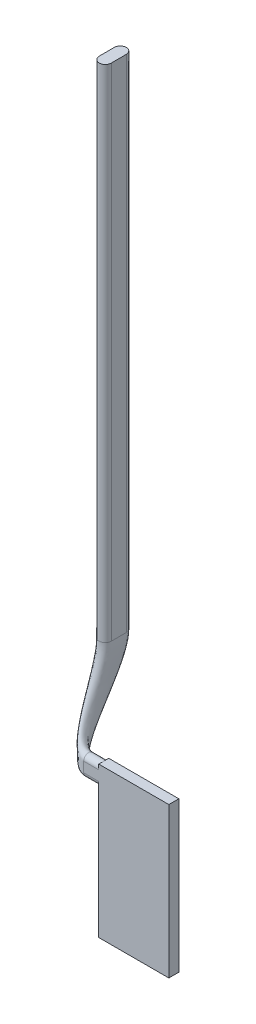
ISO-10303-21;
HEADER;
FILE_DESCRIPTION(('STEP AP214'),'2;1');
FILE_NAME('part.step','',(''),(''),'','','');
FILE_SCHEMA(('AUTOMOTIVE_DESIGN { 1 0 10303 214 1 1 1 1 }'));
ENDSEC;
DATA;
#1=APPLICATION_CONTEXT('core data for automotive mechanical design processes');
#2=APPLICATION_PROTOCOL_DEFINITION('international standard','automotive_design',2000,#1);
#3=PRODUCT_CONTEXT('',#1,'mechanical');
#4=PRODUCT('Part','Part','',(#3));
#5=PRODUCT_RELATED_PRODUCT_CATEGORY('part','',(#4));
#6=PRODUCT_DEFINITION_FORMATION('','',#4);
#7=PRODUCT_DEFINITION_CONTEXT('part definition',#1,'design');
#8=PRODUCT_DEFINITION('design','',#6,#7);
#9=PRODUCT_DEFINITION_SHAPE('','',#8);
#10=(LENGTH_UNIT() NAMED_UNIT(*) SI_UNIT(.MILLI.,.METRE.));
#11=(NAMED_UNIT(*) PLANE_ANGLE_UNIT() SI_UNIT($,.RADIAN.));
#12=(NAMED_UNIT(*) SI_UNIT($,.STERADIAN.) SOLID_ANGLE_UNIT());
#13=UNCERTAINTY_MEASURE_WITH_UNIT(LENGTH_MEASURE(1.E-05),#10,'distance_accuracy_value','');
#14=(GEOMETRIC_REPRESENTATION_CONTEXT(3) GLOBAL_UNCERTAINTY_ASSIGNED_CONTEXT((#13)) GLOBAL_UNIT_ASSIGNED_CONTEXT((#10,
#11,#12)) REPRESENTATION_CONTEXT('',''));
#15=CARTESIAN_POINT('',(0.,0.,0.));
#16=DIRECTION('',(0.,0.,1.));
#17=DIRECTION('',(1.,0.,0.));
#18=AXIS2_PLACEMENT_3D('',#15,#16,#17);
#19=CARTESIAN_POINT('',(-3.5,-7.5,1.));
#20=DIRECTION('',(1.,0.,0.));
#21=DIRECTION('',(0.,0.,-1.));
#22=AXIS2_PLACEMENT_3D('',#19,#20,#21);
#23=PLANE('',#22);
#24=CARTESIAN_POINT('',(-3.5,7.,0.498601242204725));
#25=DIRECTION('',(-1.,0.,0.));
#26=DIRECTION('',(0.,0.,1.));
#27=AXIS2_PLACEMENT_3D('',#24,#25,#26);
#28=CIRCLE('',#27,0.501398757795276);
#29=CARTESIAN_POINT('',(-3.5,7.,1.));
#30=VERTEX_POINT('',#29);
#31=CARTESIAN_POINT('',(-3.5,7.5,0.536027360339593));
#32=VERTEX_POINT('',#31);
#33=EDGE_CURVE('E226',#30,#32,#28,.T.);
#34=ORIENTED_EDGE('',*,*,#33,.F.);
#35=DIRECTION('',(0.,-1.,0.));
#36=VECTOR('',#35,1.);
#37=CARTESIAN_POINT('',(-3.5,-7.5,1.));
#38=LINE('',#37,#36);
#39=CARTESIAN_POINT('',(-3.5,7.5,1.));
#40=VERTEX_POINT('',#39);
#41=EDGE_CURVE('E251',#40,#30,#38,.T.);
#42=ORIENTED_EDGE('',*,*,#41,.F.);
#43=DIRECTION('',(0.,0.,-1.));
#44=VECTOR('',#43,1.);
#45=CARTESIAN_POINT('',(-3.5,7.5,1.));
#46=LINE('',#45,#44);
#47=EDGE_CURVE('E430',#40,#32,#46,.T.);
#48=ORIENTED_EDGE('',*,*,#47,.T.);
#49=EDGE_LOOP('',(#34,#42,#48));
#50=FACE_BOUND('',#49,.T.);
#51=ADVANCED_FACE('F21',(#50),#23,.F.);
#52=CARTESIAN_POINT('',(-3.5,7.5,0.461175124069856));
#53=VERTEX_POINT('',#52);
#54=CARTESIAN_POINT('',(-3.5,7.0528915455489,0.));
#55=VERTEX_POINT('',#54);
#56=EDGE_CURVE('E12',#53,#55,#28,.T.);
#57=ORIENTED_EDGE('',*,*,#56,.F.);
#58=CARTESIAN_POINT('',(-3.5,7.5,0.));
#59=VERTEX_POINT('',#58);
#60=EDGE_CURVE('E499',#53,#59,#46,.T.);
#61=ORIENTED_EDGE('',*,*,#60,.T.);
#62=DIRECTION('',(0.,-1.,0.));
#63=VECTOR('',#62,1.);
#64=CARTESIAN_POINT('',(-3.5,-7.5,0.));
#65=LINE('',#64,#63);
#66=EDGE_CURVE('E483',#59,#55,#65,.T.);
#67=ORIENTED_EDGE('',*,*,#66,.T.);
#68=EDGE_LOOP('',(#57,#61,#67));
#69=FACE_BOUND('',#68,.T.);
#70=ADVANCED_FACE('F452',(#69),#23,.F.);
#71=CARTESIAN_POINT('',(-3.5,6.,0.498601242204725));
#72=DIRECTION('',(-1.,0.,0.));
#73=DIRECTION('',(0.,0.,1.));
#74=AXIS2_PLACEMENT_3D('',#71,#72,#73);
#75=CIRCLE('',#74,0.501398757795275);
#76=CARTESIAN_POINT('',(-3.5,5.9471084544511,0.));
#77=VERTEX_POINT('',#76);
#78=CARTESIAN_POINT('',(-3.5,6.,1.));
#79=VERTEX_POINT('',#78);
#80=EDGE_CURVE('E32',#77,#79,#75,.T.);
#81=ORIENTED_EDGE('',*,*,#80,.F.);
#82=CARTESIAN_POINT('',(-3.5,-7.5,0.));
#83=VERTEX_POINT('',#82);
#84=EDGE_CURVE('E478',#77,#83,#65,.T.);
#85=ORIENTED_EDGE('',*,*,#84,.T.);
#86=DIRECTION('',(0.,0.,-1.));
#87=VECTOR('',#86,1.);
#88=CARTESIAN_POINT('',(-3.5,-7.5,1.));
#89=LINE('',#88,#87);
#90=CARTESIAN_POINT('',(-3.5,-7.5,1.));
#91=VERTEX_POINT('',#90);
#92=EDGE_CURVE('E415',#91,#83,#89,.T.);
#93=ORIENTED_EDGE('',*,*,#92,.F.);
#94=EDGE_CURVE('E469',#79,#91,#38,.T.);
#95=ORIENTED_EDGE('',*,*,#94,.F.);
#96=EDGE_LOOP('',(#81,#85,#93,#95));
#97=FACE_BOUND('',#96,.T.);
#98=ADVANCED_FACE('F23',(#97),#23,.F.);
#99=CARTESIAN_POINT('',(3.5,-7.5,1.));
#100=DIRECTION('',(0.,1.,0.));
#101=DIRECTION('',(0.,0.,1.));
#102=AXIS2_PLACEMENT_3D('',#99,#100,#101);
#103=PLANE('',#102);
#104=DIRECTION('',(1.,0.,0.));
#105=VECTOR('',#104,1.);
#106=CARTESIAN_POINT('',(3.5,-7.5,0.));
#107=LINE('',#106,#105);
#108=CARTESIAN_POINT('',(3.5,-7.5,0.));
#109=VERTEX_POINT('',#108);
#110=EDGE_CURVE('E489',#83,#109,#107,.T.);
#111=ORIENTED_EDGE('',*,*,#110,.T.);
#112=DIRECTION('',(0.,0.,-1.));
#113=VECTOR('',#112,1.);
#114=CARTESIAN_POINT('',(3.5,-7.5,1.));
#115=LINE('',#114,#113);
#116=CARTESIAN_POINT('',(3.5,-7.5,1.));
#117=VERTEX_POINT('',#116);
#118=EDGE_CURVE('E417',#117,#109,#115,.T.);
#119=ORIENTED_EDGE('',*,*,#118,.F.);
#120=DIRECTION('',(1.,0.,0.));
#121=VECTOR('',#120,1.);
#122=CARTESIAN_POINT('',(3.5,-7.5,1.));
#123=LINE('',#122,#121);
#124=EDGE_CURVE('E468',#91,#117,#123,.T.);
#125=ORIENTED_EDGE('',*,*,#124,.F.);
#126=ORIENTED_EDGE('',*,*,#92,.T.);
#127=EDGE_LOOP('',(#111,#119,#125,#126));
#128=FACE_BOUND('',#127,.T.);
#129=ADVANCED_FACE('F444',(#128),#103,.F.);
#130=CARTESIAN_POINT('',(3.5,-7.5,1.));
#131=DIRECTION('',(-1.,0.,0.));
#132=DIRECTION('',(0.,0.,1.));
#133=AXIS2_PLACEMENT_3D('',#130,#131,#132);
#134=PLANE('',#133);
#135=DIRECTION('',(0.,1.,0.));
#136=VECTOR('',#135,1.);
#137=CARTESIAN_POINT('',(3.5,-7.5,0.));
#138=LINE('',#137,#136);
#139=CARTESIAN_POINT('',(3.5,7.5,0.));
#140=VERTEX_POINT('',#139);
#141=EDGE_CURVE('E491',#109,#140,#138,.T.);
#142=ORIENTED_EDGE('',*,*,#141,.T.);
#143=DIRECTION('',(0.,0.,-1.));
#144=VECTOR('',#143,1.);
#145=CARTESIAN_POINT('',(3.5,7.5,1.));
#146=LINE('',#145,#144);
#147=CARTESIAN_POINT('',(3.5,7.5,1.));
#148=VERTEX_POINT('',#147);
#149=EDGE_CURVE('E423',#148,#140,#146,.T.);
#150=ORIENTED_EDGE('',*,*,#149,.F.);
#151=DIRECTION('',(0.,1.,0.));
#152=VECTOR('',#151,1.);
#153=CARTESIAN_POINT('',(3.5,-7.5,1.));
#154=LINE('',#153,#152);
#155=EDGE_CURVE('E500',#117,#148,#154,.T.);
#156=ORIENTED_EDGE('',*,*,#155,.F.);
#157=ORIENTED_EDGE('',*,*,#118,.T.);
#158=EDGE_LOOP('',(#142,#150,#156,#157));
#159=FACE_BOUND('',#158,.T.);
#160=ADVANCED_FACE('F441',(#159),#134,.F.);
#161=CARTESIAN_POINT('',(3.5,7.5,1.));
#162=DIRECTION('',(0.,-1.,0.));
#163=DIRECTION('',(0.,0.,-1.));
#164=AXIS2_PLACEMENT_3D('',#161,#162,#163);
#165=PLANE('',#164);
#166=DIRECTION('',(-1.,0.,0.));
#167=VECTOR('',#166,1.);
#168=CARTESIAN_POINT('',(3.5,7.5,0.));
#169=LINE('',#168,#167);
#170=EDGE_CURVE('E493',#140,#59,#169,.T.);
#171=ORIENTED_EDGE('',*,*,#170,.T.);
#172=ORIENTED_EDGE('',*,*,#60,.F.);
#173=CARTESIAN_POINT('',(-3.5,7.,0.498601242204725));
#174=DIRECTION('',(-1.,0.,0.));
#175=DIRECTION('',(0.,0.997210288670387,0.0746434201381715));
#176=AXIS2_PLACEMENT_3D('',#173,#174,#175);
#177=CIRCLE('',#176,0.501398757795276);
#178=EDGE_CURVE('E45',#32,#53,#177,.T.);
#179=ORIENTED_EDGE('',*,*,#178,.F.);
#180=ORIENTED_EDGE('',*,*,#47,.F.);
#181=DIRECTION('',(-1.,0.,0.));
#182=VECTOR('',#181,1.);
#183=CARTESIAN_POINT('',(3.5,7.5,1.));
#184=LINE('',#183,#182);
#185=EDGE_CURVE('E467',#148,#40,#184,.T.);
#186=ORIENTED_EDGE('',*,*,#185,.F.);
#187=ORIENTED_EDGE('',*,*,#149,.T.);
#188=EDGE_LOOP('',(#171,#172,#179,#180,#186,#187));
#189=FACE_BOUND('',#188,.T.);
#190=ADVANCED_FACE('F432',(#189),#165,.F.);
#191=CARTESIAN_POINT('',(0.,0.,1.));
#192=DIRECTION('',(0.,0.,1.));
#193=DIRECTION('',(1.,0.,0.));
#194=AXIS2_PLACEMENT_3D('',#191,#192,#193);
#195=PLANE('',#194);
#196=ORIENTED_EDGE('',*,*,#41,.T.);
#197=DIRECTION('',(1.,0.,0.));
#198=VECTOR('',#197,1.);
#199=CARTESIAN_POINT('',(-5.,7.,1.));
#200=LINE('',#199,#198);
#201=CARTESIAN_POINT('',(-5.,7.,1.));
#202=VERTEX_POINT('',#201);
#203=EDGE_CURVE('E397',#202,#30,#200,.T.);
#204=ORIENTED_EDGE('',*,*,#203,.F.);
#205=DIRECTION('',(0.,1.,0.));
#206=VECTOR('',#205,1.);
#207=CARTESIAN_POINT('',(-5.,0.,1.));
#208=LINE('',#207,#206);
#209=CARTESIAN_POINT('',(-5.,6.,1.));
#210=VERTEX_POINT('',#209);
#211=EDGE_CURVE('E400',#210,#202,#208,.T.);
#212=ORIENTED_EDGE('',*,*,#211,.F.);
#213=DIRECTION('',(1.,0.,0.));
#214=VECTOR('',#213,1.);
#215=CARTESIAN_POINT('',(-5.,6.,1.));
#216=LINE('',#215,#214);
#217=EDGE_CURVE('E392',#210,#79,#216,.T.);
#218=ORIENTED_EDGE('',*,*,#217,.T.);
#219=ORIENTED_EDGE('',*,*,#94,.T.);
#220=ORIENTED_EDGE('',*,*,#124,.T.);
#221=ORIENTED_EDGE('',*,*,#155,.T.);
#222=ORIENTED_EDGE('',*,*,#185,.T.);
#223=EDGE_LOOP('',(#196,#204,#212,#218,#219,#220,#221,#222));
#224=FACE_BOUND('',#223,.T.);
#225=ADVANCED_FACE('F267',(#224),#195,.T.);
#226=CARTESIAN_POINT('',(0.,0.,0.));
#227=DIRECTION('',(0.,0.,1.));
#228=DIRECTION('',(1.,0.,0.));
#229=AXIS2_PLACEMENT_3D('',#226,#227,#228);
#230=PLANE('',#229);
#231=ORIENTED_EDGE('',*,*,#66,.F.);
#232=ORIENTED_EDGE('',*,*,#170,.F.);
#233=ORIENTED_EDGE('',*,*,#141,.F.);
#234=ORIENTED_EDGE('',*,*,#110,.F.);
#235=ORIENTED_EDGE('',*,*,#84,.F.);
#236=EDGE_CURVE('E481',#55,#77,#65,.T.);
#237=ORIENTED_EDGE('',*,*,#236,.F.);
#238=EDGE_LOOP('',(#231,#232,#233,#234,#235,#237));
#239=FACE_BOUND('',#238,.T.);
#240=ADVANCED_FACE('F442',(#239),#230,.F.);
#241=CARTESIAN_POINT('',(-3.5,7.,0.498601242204725));
#242=DIRECTION('',(-1.,0.,0.));
#243=DIRECTION('',(0.,0.,1.));
#244=AXIS2_PLACEMENT_3D('',#241,#242,#243);
#245=PLANE('',#244);
#246=CARTESIAN_POINT('',(-3.5,7.,-0.00279751559055128));
#247=VERTEX_POINT('',#246);
#248=EDGE_CURVE('E225',#55,#247,#28,.T.);
#249=ORIENTED_EDGE('',*,*,#248,.F.);
#250=ORIENTED_EDGE('',*,*,#236,.T.);
#251=CARTESIAN_POINT('',(-3.5,6.,-0.00279751559055096));
#252=VERTEX_POINT('',#251);
#253=EDGE_CURVE('E246',#252,#77,#75,.T.);
#254=ORIENTED_EDGE('',*,*,#253,.F.);
#255=DIRECTION('',(0.,-1.,0.));
#256=VECTOR('',#255,1.);
#257=CARTESIAN_POINT('',(-3.5,7.,-0.00279751559055128));
#258=LINE('',#257,#256);
#259=EDGE_CURVE('E233',#247,#252,#258,.T.);
#260=ORIENTED_EDGE('',*,*,#259,.F.);
#261=EDGE_LOOP('',(#249,#250,#254,#260));
#262=FACE_BOUND('',#261,.T.);
#263=ADVANCED_FACE('F264',(#262),#245,.F.);
#264=CARTESIAN_POINT('',(-5.,7.,0.498601242204725));
#265=DIRECTION('',(1.,0.,0.));
#266=DIRECTION('',(0.,0.,-1.));
#267=AXIS2_PLACEMENT_3D('',#264,#265,#266);
#268=CYLINDRICAL_SURFACE('',#267,0.501398757795276);
#269=ORIENTED_EDGE('',*,*,#33,.T.);
#270=ORIENTED_EDGE('',*,*,#178,.T.);
#271=ORIENTED_EDGE('',*,*,#56,.T.);
#272=ORIENTED_EDGE('',*,*,#248,.T.);
#273=DIRECTION('',(1.,0.,0.));
#274=VECTOR('',#273,1.);
#275=CARTESIAN_POINT('',(-5.,7.,-0.00279751559055128));
#276=LINE('',#275,#274);
#277=CARTESIAN_POINT('',(-5.,7.,-0.00279751559055128));
#278=VERTEX_POINT('',#277);
#279=EDGE_CURVE('E391',#278,#247,#276,.T.);
#280=ORIENTED_EDGE('',*,*,#279,.F.);
#281=CARTESIAN_POINT('',(-5.,6.00000000041596,1.));
#282=CARTESIAN_POINT('',(-5.,6.08921512380112,1.));
#283=CARTESIAN_POINT('',(-5.,6.25796420077075,1.));
#284=CARTESIAN_POINT('',(-5.,6.5,1.));
#285=CARTESIAN_POINT('',(-5.,6.74203579922925,1.));
#286=CARTESIAN_POINT('',(-5.,6.91078487619888,1.));
#287=CARTESIAN_POINT('',(-5.,7.12538409636572,1.));
#288=CARTESIAN_POINT('',(-5.,7.35336724569681,0.913009209824185));
#289=CARTESIAN_POINT('',(-5.,7.48742945168754,0.666093205488082));
#290=CARTESIAN_POINT('',(-5.,7.50555323466214,0.498601242204724));
#291=CARTESIAN_POINT('',(-5.,7.48742945168754,0.331109278921365));
#292=CARTESIAN_POINT('',(-5.,7.35336724569681,0.0841932745852613));
#293=CARTESIAN_POINT('',(-5.,7.12538409636572,-0.00279751559055127));
#294=CARTESIAN_POINT('',(-5.,6.91078487619888,-0.00279751559055125));
#295=CARTESIAN_POINT('',(-5.,6.74203579922925,-0.00279751559055117));
#296=CARTESIAN_POINT('',(-5.,6.5,-0.00279751559055106));
#297=CARTESIAN_POINT('',(-5.,6.25796420077075,-0.00279751559055097));
#298=CARTESIAN_POINT('',(-5.,6.08921512380112,-0.00279751559055089));
#299=CARTESIAN_POINT('',(-5.,5.87461590363428,-0.00279751559055097));
#300=CARTESIAN_POINT('',(-5.,5.61406373297018,0.0966205303246644));
#301=CARTESIAN_POINT('',(-5.,5.4835724955531,0.398106064234709));
#302=CARTESIAN_POINT('',(-5.,5.51257054831245,0.666093205488083));
#303=CARTESIAN_POINT('',(-5.,5.59635942705667,0.820415708198148));
#304=CARTESIAN_POINT('',(-5.,5.77690883963524,0.962718232781794));
#305=CARTESIAN_POINT('',(-5.,5.9059619278297,1.));
#306=CARTESIAN_POINT('',(-5.,6.00000000041596,1.));
#307=B_SPLINE_CURVE_WITH_KNOTS('',3,(#281,#282,#283,#284,#285,#286,#287,#288,#289,#290,#291,
#292,#293,#294,#295,#296,#297,#298,#299,#300,#301,#302,#303,#304,#305,#306),.UNSPECIFIED.,.T.,
.F.,(4,1,1,1,2,1,1,1,1,1,2,1,1,1,2,1,1,1,1,1,4),(0.,0.0519661274373445,0.103932254874689,
0.155898382312034,0.207864509749378,0.280898382312034,0.335673786734025,0.353932254874689,
0.372190723015353,0.426966127437344,0.5,0.551966127437345,0.603932254874689,0.655898382312034,
0.707864509749378,0.780898382312034,0.853932254874689,0.872190723015353,0.926966127437345,
0.945224595578008,1.),.UNSPECIFIED.);
#308=EDGE_CURVE('E407',#202,#278,#307,.T.);
#309=ORIENTED_EDGE('',*,*,#308,.F.);
#310=ORIENTED_EDGE('',*,*,#203,.T.);
#311=EDGE_LOOP('',(#269,#270,#271,#272,#280,#309,#310));
#312=FACE_BOUND('',#311,.T.);
#313=ADVANCED_FACE('F253',(#312),#268,.T.);
#314=CARTESIAN_POINT('',(-5.,7.,-0.00279751559055128));
#315=DIRECTION('',(0.,0.,1.));
#316=DIRECTION('',(0.,-1.,0.));
#317=AXIS2_PLACEMENT_3D('',#314,#315,#316);
#318=PLANE('',#317);
#319=ORIENTED_EDGE('',*,*,#259,.T.);
#320=DIRECTION('',(1.,0.,0.));
#321=VECTOR('',#320,1.);
#322=CARTESIAN_POINT('',(-5.,6.,-0.00279751559055096));
#323=LINE('',#322,#321);
#324=CARTESIAN_POINT('',(-5.,6.,-0.00279751559055096));
#325=VERTEX_POINT('',#324);
#326=EDGE_CURVE('E383',#325,#252,#323,.T.);
#327=ORIENTED_EDGE('',*,*,#326,.F.);
#328=DIRECTION('',(0.,-1.,0.));
#329=VECTOR('',#328,1.);
#330=CARTESIAN_POINT('',(-5.,7.,-0.00279751559055128));
#331=LINE('',#330,#329);
#332=EDGE_CURVE('E405',#278,#325,#331,.T.);
#333=ORIENTED_EDGE('',*,*,#332,.F.);
#334=ORIENTED_EDGE('',*,*,#279,.T.);
#335=EDGE_LOOP('',(#319,#327,#333,#334));
#336=FACE_BOUND('',#335,.T.);
#337=ADVANCED_FACE('F263',(#336),#318,.F.);
#338=CARTESIAN_POINT('',(-5.,6.,0.498601242204725));
#339=DIRECTION('',(1.,0.,0.));
#340=DIRECTION('',(0.,0.,-1.));
#341=AXIS2_PLACEMENT_3D('',#338,#339,#340);
#342=CYLINDRICAL_SURFACE('',#341,0.501398757795275);
#343=ORIENTED_EDGE('',*,*,#253,.T.);
#344=ORIENTED_EDGE('',*,*,#80,.T.);
#345=ORIENTED_EDGE('',*,*,#217,.F.);
#346=CARTESIAN_POINT('',(-5.00000000000001,6.00000000041596,1.));
#347=CARTESIAN_POINT('',(-5.00000000000001,6.08921512380112,1.));
#348=CARTESIAN_POINT('',(-5.00000000000001,6.25796420077075,1.));
#349=CARTESIAN_POINT('',(-5.00000000000001,6.5,1.));
#350=CARTESIAN_POINT('',(-5.00000000000001,6.74203579922925,1.));
#351=CARTESIAN_POINT('',(-5.00000000000001,6.91078487619888,1.));
#352=CARTESIAN_POINT('',(-5.00000000000001,7.12538409636572,1.));
#353=CARTESIAN_POINT('',(-5.00000000000001,7.35336724569681,0.913009209824185));
#354=CARTESIAN_POINT('',(-5.00000000000001,7.48742945168754,0.666093205488082));
#355=CARTESIAN_POINT('',(-5.00000000000001,7.50555323466214,0.498601242204724));
#356=CARTESIAN_POINT('',(-5.00000000000001,7.48742945168754,0.331109278921365));
#357=CARTESIAN_POINT('',(-5.00000000000001,7.35336724569681,0.0841932745852613));
#358=CARTESIAN_POINT('',(-5.00000000000001,7.12538409636572,-0.00279751559055127));
#359=CARTESIAN_POINT('',(-5.00000000000001,6.91078487619888,-0.00279751559055125));
#360=CARTESIAN_POINT('',(-5.00000000000001,6.74203579922925,-0.00279751559055117));
#361=CARTESIAN_POINT('',(-5.00000000000001,6.5,-0.00279751559055106));
#362=CARTESIAN_POINT('',(-5.00000000000001,6.25796420077075,-0.00279751559055097));
#363=CARTESIAN_POINT('',(-5.00000000000001,6.08921512380112,-0.00279751559055089));
#364=CARTESIAN_POINT('',(-5.00000000000001,5.87461590363428,-0.00279751559055097));
#365=CARTESIAN_POINT('',(-5.00000000000001,5.61406373297018,0.0966205303246644));
#366=CARTESIAN_POINT('',(-5.00000000000001,5.4835724955531,0.398106064234709));
#367=CARTESIAN_POINT('',(-5.00000000000001,5.51257054831245,0.666093205488083));
#368=CARTESIAN_POINT('',(-5.00000000000001,5.59635942705667,0.820415708198148));
#369=CARTESIAN_POINT('',(-5.00000000000001,5.77690883963524,0.962718232781794));
#370=CARTESIAN_POINT('',(-5.00000000000001,5.9059619278297,1.));
#371=CARTESIAN_POINT('',(-5.00000000000001,6.00000000041596,1.));
#372=B_SPLINE_CURVE_WITH_KNOTS('',3,(#346,#347,#348,#349,#350,#351,#352,#353,#354,#355,#356,
#357,#358,#359,#360,#361,#362,#363,#364,#365,#366,#367,#368,#369,#370,#371),.UNSPECIFIED.,.T.,
.F.,(4,1,1,1,2,1,1,1,1,1,2,1,1,1,2,1,1,1,1,1,4),(0.,0.0519661274373445,0.103932254874689,
0.155898382312034,0.207864509749378,0.280898382312034,0.335673786734025,0.353932254874689,
0.372190723015353,0.426966127437344,0.5,0.551966127437345,0.603932254874689,0.655898382312034,
0.707864509749378,0.780898382312034,0.853932254874689,0.872190723015353,0.926966127437345,
0.945224595578008,1.),.UNSPECIFIED.);
#373=EDGE_CURVE('E403',#325,#210,#372,.T.);
#374=ORIENTED_EDGE('',*,*,#373,.F.);
#375=ORIENTED_EDGE('',*,*,#326,.T.);
#376=EDGE_LOOP('',(#343,#344,#345,#374,#375));
#377=FACE_BOUND('',#376,.T.);
#378=ADVANCED_FACE('F309',(#377),#342,.T.);
#379=CARTESIAN_POINT('',(-5.,6.00000000041596,1.));
#380=CARTESIAN_POINT('',(-7.42314553150266,6.00000000041596,1.00000000000001));
#381=CARTESIAN_POINT('',(-7.2,11.6701878018861,-4.24999999945324));
#382=CARTESIAN_POINT('',(-7.2,15.,-4.24999999945324));
#383=CARTESIAN_POINT('',(-5.,6.08921512380112,1.));
#384=CARTESIAN_POINT('',(-7.39906256621732,6.0892151238011,1.));
#385=CARTESIAN_POINT('',(-7.2,11.707418515273,-4.13273131088562));
#386=CARTESIAN_POINT('',(-7.2,15.,-4.13273131088559));
#387=CARTESIAN_POINT('',(-5.,6.25796420077075,1.));
#388=CARTESIAN_POINT('',(-7.34276178476159,6.25796420077077,1.));
#389=CARTESIAN_POINT('',(-7.2,11.7843255886659,-3.88773158594609));
#390=CARTESIAN_POINT('',(-7.2,15.,-3.88773158594587));
#391=CARTESIAN_POINT('',(-5.,6.5,1.));
#392=CARTESIAN_POINT('',(-7.26700542627288,6.5,1.));
#393=CARTESIAN_POINT('',(-7.2,11.8933601296153,-3.5));
#394=CARTESIAN_POINT('',(-7.2,15.,-3.5));
#395=CARTESIAN_POINT('',(-5.,6.74203579922925,1.));
#396=CARTESIAN_POINT('',(-7.18854081519058,6.74203579922925,1.));
#397=CARTESIAN_POINT('',(-7.2,12.0029095878289,-3.11226841405412));
#398=CARTESIAN_POINT('',(-7.2,15.,-3.11226841405414));
#399=CARTESIAN_POINT('',(-5.,6.91078487619888,1.));
#400=CARTESIAN_POINT('',(-7.14241958612338,6.9107848761989,1.));
#401=CARTESIAN_POINT('',(-7.2,12.0740237794923,-2.86726868911445));
#402=CARTESIAN_POINT('',(-7.2,15.,-2.86726868911442));
#403=CARTESIAN_POINT('',(-5.,7.12538409636572,1.));
#404=CARTESIAN_POINT('',(-7.07489951526655,7.12538409636572,1.));
#405=CARTESIAN_POINT('',(-7.2,12.1661351117623,-2.58518905775015));
#406=CARTESIAN_POINT('',(-7.2,15.,-2.5851890577501));
#407=CARTESIAN_POINT('',(-5.,7.35336724569681,0.913009209824185));
#408=CARTESIAN_POINT('',(-6.98854648390737,7.35336724569677,0.913009209824214));
#409=CARTESIAN_POINT('',(-7.07773225855393,12.2697746553796,-2.31109785236382));
#410=CARTESIAN_POINT('',(-7.07773225855396,15.,-2.31109785236385));
#411=CARTESIAN_POINT('',(-5.,7.48742945168754,0.666093205488082));
#412=CARTESIAN_POINT('',(-6.88360668286077,7.48742945168754,0.666093205488094));
#413=CARTESIAN_POINT('',(-6.79177726597812,12.3535693032317,-2.16505645243536));
#414=CARTESIAN_POINT('',(-6.79177726597809,15.,-2.16505645243535));
#415=CARTESIAN_POINT('',(-5.,7.50555323466214,0.498601242204724));
#416=CARTESIAN_POINT('',(-6.83461671894048,7.50555323466214,0.49860124220474));
#417=CARTESIAN_POINT('',(-6.6,12.3794580846102,-2.14596975360593));
#418=CARTESIAN_POINT('',(-6.6,15.,-2.14596975360593));
#419=CARTESIAN_POINT('',(-5.,7.48742945168754,0.331109278921365));
#420=CARTESIAN_POINT('',(-6.79562092910882,7.48742945168755,0.331109278921383));
#421=CARTESIAN_POINT('',(-6.40822273402194,12.3905092938165,-2.16505645243534));
#422=CARTESIAN_POINT('',(-6.40822273402192,15.,-2.16505645243535));
#423=CARTESIAN_POINT('',(-5.,7.35336724569681,0.0841932745852613));
#424=CARTESIAN_POINT('',(-6.76616970873753,7.35336724569681,0.0841932745852629));
#425=CARTESIAN_POINT('',(-6.12226774144602,12.3631817994468,-2.31109785236382));
#426=CARTESIAN_POINT('',(-6.122267741446,15.,-2.31109785236385));
#427=CARTESIAN_POINT('',(-5.,7.12538409636572,-0.00279751559055127));
#428=CARTESIAN_POINT('',(-6.80611012370013,7.12538409636576,-0.00279751559055106));
#429=CARTESIAN_POINT('',(-6.,12.2793251300753,-2.5851890577501));
#430=CARTESIAN_POINT('',(-6.,15.,-2.5851890577501));
#431=CARTESIAN_POINT('',(-5.,6.91078487619888,-0.00279751559055125));
#432=CARTESIAN_POINT('',(-6.8586802004429,6.91078487619894,-0.0027975155905514));
#433=CARTESIAN_POINT('',(-6.,12.1946319669727,-2.86726868911438));
#434=CARTESIAN_POINT('',(-6.,15.,-2.86726868911442));
#435=CARTESIAN_POINT('',(-5.,6.74203579922925,-0.00279751559055117));
#436=CARTESIAN_POINT('',(-6.9103812373685,6.7420357992293,-0.00279751559055104));
#437=CARTESIAN_POINT('',(-6.,12.1226278256363,-3.11226841405405));
#438=CARTESIAN_POINT('',(-6.,15.,-3.11226841405413));
#439=CARTESIAN_POINT('',(-5.,6.5,-0.00279751559055106));
#440=CARTESIAN_POINT('',(-6.98156740443526,6.50000000000008,-0.00279751559055129));
#441=CARTESIAN_POINT('',(-6.,12.0180396388048,-3.5));
#442=CARTESIAN_POINT('',(-6.,15.,-3.5));
#443=CARTESIAN_POINT('',(-5.,6.25796420077075,-0.00279751559055097));
#444=CARTESIAN_POINT('',(-7.05802409787699,6.25796420077074,-0.00279751559055016));
#445=CARTESIAN_POINT('',(-6.,11.9105386661582,-3.88773158594592));
#446=CARTESIAN_POINT('',(-6.,15.,-3.88773158594586));
#447=CARTESIAN_POINT('',(-5.,6.08921512380112,-0.00279751559055089));
#448=CARTESIAN_POINT('',(-7.10530186157019,6.08921512380115,-0.00279751559055264));
#449=CARTESIAN_POINT('',(-6.,11.8382423169344,-4.1327313108856));
#450=CARTESIAN_POINT('',(-6.,15.,-4.13273131088559));
#451=CARTESIAN_POINT('',(-5.,5.87461590363428,-0.00279751559055097));
#452=CARTESIAN_POINT('',(-7.1736606295505,5.87461590363434,-0.00279751559054852));
#453=CARTESIAN_POINT('',(-6.,11.7453222490764,-4.41481094224987));
#454=CARTESIAN_POINT('',(-6.,15.,-4.4148109422499));
#455=CARTESIAN_POINT('',(-5.,5.61406373297018,0.0966205303246644));
#456=CARTESIAN_POINT('',(-7.27242286922654,5.61406373297022,0.0966205303246837));
#457=CARTESIAN_POINT('',(-6.13973456165258,11.6269388221118,-4.72805803411986));
#458=CARTESIAN_POINT('',(-6.1397345616526,15.,-4.7280580341199));
#459=CARTESIAN_POINT('',(-5.,5.4835724955531,0.398106064234709));
#460=CARTESIAN_POINT('',(-7.39284994508637,5.48357249555311,0.398106064234485));
#461=CARTESIAN_POINT('',(-6.48493364041308,11.5363396298344,-4.86548226569175));
#462=CARTESIAN_POINT('',(-6.48493364041315,15.,-4.86548226569172));
#463=CARTESIAN_POINT('',(-5.,5.51257054831245,0.666093205488083));
#464=CARTESIAN_POINT('',(-7.46111307991168,5.51257054831244,0.666093205488092));
#465=CARTESIAN_POINT('',(-6.79177726597819,11.5127835029949,-4.83494354756463));
#466=CARTESIAN_POINT('',(-6.79177726597808,15.,-4.83494354756465));
#467=CARTESIAN_POINT('',(-5.,5.59635942705667,0.820415708198148));
#468=CARTESIAN_POINT('',(-7.48296503600826,5.59635942705656,0.820415708198048));
#469=CARTESIAN_POINT('',(-6.97049913633801,11.5258578212653,-4.74366767260935));
#470=CARTESIAN_POINT('',(-6.97049913633802,15.,-4.74366767260934));
#471=CARTESIAN_POINT('',(-5.,5.77690883963524,0.962718232781794));
#472=CARTESIAN_POINT('',(-7.47635148890265,5.7769088396353,0.962718232781846));
#473=CARTESIAN_POINT('',(-7.14759953938028,11.5804313523752,-4.53227860170115));
#474=CARTESIAN_POINT('',(-7.14759953938028,15.,-4.53227860170115));
#475=CARTESIAN_POINT('',(-5.,5.9059619278297,1.));
#476=CARTESIAN_POINT('',(-7.44853041639284,5.90596192782971,1.00000000000001));
#477=CARTESIAN_POINT('',(-7.2,11.6309444046338,-4.3736082065507));
#478=CARTESIAN_POINT('',(-7.2,15.,-4.37360820655073));
#479=CARTESIAN_POINT('',(-5.,6.00000000041596,1.));
#480=CARTESIAN_POINT('',(-7.42314553150266,6.00000000041596,1.00000000000001));
#481=CARTESIAN_POINT('',(-7.2,11.6701878018861,-4.24999999945324));
#482=CARTESIAN_POINT('',(-7.2,15.,-4.24999999945324));
#483=B_SPLINE_SURFACE_WITH_KNOTS('',3,3,((#379,#380,#381,#382),(#383,#384,#385,#386),(#387,#388,
#389,#390),(#391,#392,#393,#394),(#395,#396,#397,#398),(#399,#400,#401,#402),(#403,#404,#405,
#406),(#407,#408,#409,#410),(#411,#412,#413,#414),(#415,#416,#417,#418),(#419,#420,#421,#422),
(#423,#424,#425,#426),(#427,#428,#429,#430),(#431,#432,#433,#434),(#435,#436,#437,#438),(#439,
#440,#441,#442),(#443,#444,#445,#446),(#447,#448,#449,#450),(#451,#452,#453,#454),(#455,#456,
#457,#458),(#459,#460,#461,#462),(#463,#464,#465,#466),(#467,#468,#469,#470),(#471,#472,#473,
#474),(#475,#476,#477,#478),(#479,#480,#481,#482)),.UNSPECIFIED.,.T.,.F.,.F.,(4,1,1,1,2,1,1,1,1,
1,2,1,1,1,2,1,1,1,1,1,4),(4,4),(0.,0.0519661274373445,0.103932254874689,0.155898382312034,
0.207864509749378,0.280898382312034,0.335673786734025,0.353932254874689,0.372190723015353,
0.426966127437344,0.5,0.551966127437345,0.603932254874689,0.655898382312034,0.707864509749378,
0.780898382312034,0.853932254874689,0.872190723015353,0.926966127437345,0.945224595578008,1.),
(0.,1.),.UNSPECIFIED.);
#484=CARTESIAN_POINT('',(-7.2,15.,-4.24999999945324));
#485=CARTESIAN_POINT('',(-7.2,15.,-4.37360820655073));
#486=CARTESIAN_POINT('',(-7.14759953938028,15.,-4.53227860170115));
#487=CARTESIAN_POINT('',(-6.97049913633802,15.,-4.74366767260934));
#488=CARTESIAN_POINT('',(-6.79177726597808,15.,-4.83494354756465));
#489=CARTESIAN_POINT('',(-6.48493364041315,15.,-4.86548226569172));
#490=CARTESIAN_POINT('',(-6.1397345616526,15.,-4.7280580341199));
#491=CARTESIAN_POINT('',(-6.,15.,-4.4148109422499));
#492=CARTESIAN_POINT('',(-6.,15.,-4.13273131088559));
#493=CARTESIAN_POINT('',(-6.,15.,-3.88773158594586));
#494=CARTESIAN_POINT('',(-6.,15.,-3.5));
#495=CARTESIAN_POINT('',(-6.,15.,-3.11226841405413));
#496=CARTESIAN_POINT('',(-6.,15.,-2.86726868911442));
#497=CARTESIAN_POINT('',(-6.,15.,-2.5851890577501));
#498=CARTESIAN_POINT('',(-6.122267741446,15.,-2.31109785236385));
#499=CARTESIAN_POINT('',(-6.40822273402192,15.,-2.16505645243535));
#500=CARTESIAN_POINT('',(-6.6,15.,-2.14596975360593));
#501=CARTESIAN_POINT('',(-6.79177726597809,15.,-2.16505645243535));
#502=CARTESIAN_POINT('',(-7.07773225855396,15.,-2.31109785236385));
#503=CARTESIAN_POINT('',(-7.2,15.,-2.5851890577501));
#504=CARTESIAN_POINT('',(-7.2,15.,-2.86726868911442));
#505=CARTESIAN_POINT('',(-7.2,15.,-3.11226841405414));
#506=CARTESIAN_POINT('',(-7.2,15.,-3.5));
#507=CARTESIAN_POINT('',(-7.2,15.,-3.88773158594587));
#508=CARTESIAN_POINT('',(-7.2,15.,-4.13273131088559));
#509=CARTESIAN_POINT('',(-7.2,15.,-4.24999999945324));
#510=B_SPLINE_CURVE_WITH_KNOTS('',3,(#484,#485,#486,#487,#488,#489,#490,#491,#492,#493,#494,
#495,#496,#497,#498,#499,#500,#501,#502,#503,#504,#505,#506,#507,#508,#509),.UNSPECIFIED.,.T.,
.F.,(4,1,1,1,1,1,2,1,1,1,2,1,1,1,1,1,2,1,1,1,4),(0.,0.054775404421992,0.0730338725626549,
0.127809276984647,0.146067745125311,0.219101617687966,0.292135490250622,0.344101617687966,
0.396067745125311,0.448033872562655,0.5,0.573033872562656,0.627809276984647,0.646067745125311,
0.664326213265975,0.719101617687967,0.792135490250622,0.844101617687967,0.896067745125311,
0.948033872562655,1.),.UNSPECIFIED.);
#511=CARTESIAN_POINT('',(-6.,15.,-4.25));
#512=VERTEX_POINT('',#511);
#513=CARTESIAN_POINT('',(-7.2,15.,-4.25));
#514=VERTEX_POINT('',#513);
#515=EDGE_CURVE('E150',#512,#514,#510,.F.);
#516=CARTESIAN_POINT('',(-7.2,15.,-4.24999999945324));
#517=CARTESIAN_POINT('',(-7.2,15.,-4.37360820655073));
#518=CARTESIAN_POINT('',(-7.14759953938028,15.,-4.53227860170115));
#519=CARTESIAN_POINT('',(-6.97049913633802,15.,-4.74366767260934));
#520=CARTESIAN_POINT('',(-6.79177726597808,15.,-4.83494354756465));
#521=CARTESIAN_POINT('',(-6.48493364041315,15.,-4.86548226569172));
#522=CARTESIAN_POINT('',(-6.1397345616526,15.,-4.7280580341199));
#523=CARTESIAN_POINT('',(-6.,15.,-4.4148109422499));
#524=CARTESIAN_POINT('',(-6.,15.,-4.13273131088559));
#525=CARTESIAN_POINT('',(-6.,15.,-3.88773158594586));
#526=CARTESIAN_POINT('',(-6.,15.,-3.5));
#527=CARTESIAN_POINT('',(-6.,15.,-3.11226841405413));
#528=CARTESIAN_POINT('',(-6.,15.,-2.86726868911442));
#529=CARTESIAN_POINT('',(-6.,15.,-2.5851890577501));
#530=CARTESIAN_POINT('',(-6.122267741446,15.,-2.31109785236385));
#531=CARTESIAN_POINT('',(-6.40822273402192,15.,-2.16505645243535));
#532=CARTESIAN_POINT('',(-6.6,15.,-2.14596975360593));
#533=CARTESIAN_POINT('',(-6.79177726597809,15.,-2.16505645243535));
#534=CARTESIAN_POINT('',(-7.07773225855396,15.,-2.31109785236385));
#535=CARTESIAN_POINT('',(-7.2,15.,-2.5851890577501));
#536=CARTESIAN_POINT('',(-7.2,15.,-2.86726868911442));
#537=CARTESIAN_POINT('',(-7.2,15.,-3.11226841405414));
#538=CARTESIAN_POINT('',(-7.2,15.,-3.5));
#539=CARTESIAN_POINT('',(-7.2,15.,-3.88773158594587));
#540=CARTESIAN_POINT('',(-7.2,15.,-4.13273131088559));
#541=CARTESIAN_POINT('',(-7.2,15.,-4.24999999945324));
#542=B_SPLINE_CURVE_WITH_KNOTS('',3,(#516,#517,#518,#519,#520,#521,#522,#523,#524,#525,#526,
#527,#528,#529,#530,#531,#532,#533,#534,#535,#536,#537,#538,#539,#540,#541),.UNSPECIFIED.,.T.,
.F.,(4,1,1,1,1,1,2,1,1,1,2,1,1,1,1,1,2,1,1,1,4),(0.,0.054775404421992,0.0730338725626549,
0.127809276984647,0.146067745125311,0.219101617687966,0.292135490250622,0.344101617687966,
0.396067745125311,0.448033872562655,0.5,0.573033872562656,0.627809276984647,0.646067745125311,
0.664326213265975,0.719101617687967,0.792135490250622,0.844101617687967,0.896067745125311,
0.948033872562655,1.),.UNSPECIFIED.);
#543=CARTESIAN_POINT('',(-6.,15.,-2.75));
#544=VERTEX_POINT('',#543);
#545=EDGE_CURVE('E153',#544,#512,#542,.F.);
#546=CARTESIAN_POINT('',(-7.2,15.,-4.24999999945324));
#547=CARTESIAN_POINT('',(-7.2,15.,-4.37360820655073));
#548=CARTESIAN_POINT('',(-7.14759953938028,15.,-4.53227860170115));
#549=CARTESIAN_POINT('',(-6.97049913633802,15.,-4.74366767260934));
#550=CARTESIAN_POINT('',(-6.79177726597808,15.,-4.83494354756465));
#551=CARTESIAN_POINT('',(-6.48493364041315,15.,-4.86548226569172));
#552=CARTESIAN_POINT('',(-6.1397345616526,15.,-4.7280580341199));
#553=CARTESIAN_POINT('',(-6.,15.,-4.4148109422499));
#554=CARTESIAN_POINT('',(-6.,15.,-4.13273131088559));
#555=CARTESIAN_POINT('',(-6.,15.,-3.88773158594586));
#556=CARTESIAN_POINT('',(-6.,15.,-3.5));
#557=CARTESIAN_POINT('',(-6.,15.,-3.11226841405413));
#558=CARTESIAN_POINT('',(-6.,15.,-2.86726868911442));
#559=CARTESIAN_POINT('',(-6.,15.,-2.5851890577501));
#560=CARTESIAN_POINT('',(-6.122267741446,15.,-2.31109785236385));
#561=CARTESIAN_POINT('',(-6.40822273402192,15.,-2.16505645243535));
#562=CARTESIAN_POINT('',(-6.6,15.,-2.14596975360593));
#563=CARTESIAN_POINT('',(-6.79177726597809,15.,-2.16505645243535));
#564=CARTESIAN_POINT('',(-7.07773225855396,15.,-2.31109785236385));
#565=CARTESIAN_POINT('',(-7.2,15.,-2.5851890577501));
#566=CARTESIAN_POINT('',(-7.2,15.,-2.86726868911442));
#567=CARTESIAN_POINT('',(-7.2,15.,-3.11226841405414));
#568=CARTESIAN_POINT('',(-7.2,15.,-3.5));
#569=CARTESIAN_POINT('',(-7.2,15.,-3.88773158594587));
#570=CARTESIAN_POINT('',(-7.2,15.,-4.13273131088559));
#571=CARTESIAN_POINT('',(-7.2,15.,-4.24999999945324));
#572=B_SPLINE_CURVE_WITH_KNOTS('',3,(#546,#547,#548,#549,#550,#551,#552,#553,#554,#555,#556,
#557,#558,#559,#560,#561,#562,#563,#564,#565,#566,#567,#568,#569,#570,#571),.UNSPECIFIED.,.T.,
.F.,(4,1,1,1,1,1,2,1,1,1,2,1,1,1,1,1,2,1,1,1,4),(0.,0.054775404421992,0.0730338725626549,
0.127809276984647,0.146067745125311,0.219101617687966,0.292135490250622,0.344101617687966,
0.396067745125311,0.448033872562655,0.5,0.573033872562656,0.627809276984647,0.646067745125311,
0.664326213265975,0.719101617687967,0.792135490250622,0.844101617687967,0.896067745125311,
0.948033872562655,1.),.UNSPECIFIED.);
#573=CARTESIAN_POINT('',(-7.2,15.,-2.75));
#574=VERTEX_POINT('',#573);
#575=EDGE_CURVE('E166',#574,#544,#572,.F.);
#576=CARTESIAN_POINT('',(-7.2,15.,-4.24999999945324));
#577=CARTESIAN_POINT('',(-7.2,15.,-4.37360820655073));
#578=CARTESIAN_POINT('',(-7.14759953938028,15.,-4.53227860170115));
#579=CARTESIAN_POINT('',(-6.97049913633802,15.,-4.74366767260934));
#580=CARTESIAN_POINT('',(-6.79177726597808,15.,-4.83494354756465));
#581=CARTESIAN_POINT('',(-6.48493364041315,15.,-4.86548226569172));
#582=CARTESIAN_POINT('',(-6.1397345616526,15.,-4.7280580341199));
#583=CARTESIAN_POINT('',(-6.,15.,-4.4148109422499));
#584=CARTESIAN_POINT('',(-6.,15.,-4.13273131088559));
#585=CARTESIAN_POINT('',(-6.,15.,-3.88773158594586));
#586=CARTESIAN_POINT('',(-6.,15.,-3.5));
#587=CARTESIAN_POINT('',(-6.,15.,-3.11226841405413));
#588=CARTESIAN_POINT('',(-6.,15.,-2.86726868911442));
#589=CARTESIAN_POINT('',(-6.,15.,-2.5851890577501));
#590=CARTESIAN_POINT('',(-6.122267741446,15.,-2.31109785236385));
#591=CARTESIAN_POINT('',(-6.40822273402192,15.,-2.16505645243535));
#592=CARTESIAN_POINT('',(-6.6,15.,-2.14596975360593));
#593=CARTESIAN_POINT('',(-6.79177726597809,15.,-2.16505645243535));
#594=CARTESIAN_POINT('',(-7.07773225855396,15.,-2.31109785236385));
#595=CARTESIAN_POINT('',(-7.2,15.,-2.5851890577501));
#596=CARTESIAN_POINT('',(-7.2,15.,-2.86726868911442));
#597=CARTESIAN_POINT('',(-7.2,15.,-3.11226841405414));
#598=CARTESIAN_POINT('',(-7.2,15.,-3.5));
#599=CARTESIAN_POINT('',(-7.2,15.,-3.88773158594587));
#600=CARTESIAN_POINT('',(-7.2,15.,-4.13273131088559));
#601=CARTESIAN_POINT('',(-7.2,15.,-4.24999999945324));
#602=B_SPLINE_CURVE_WITH_KNOTS('',3,(#576,#577,#578,#579,#580,#581,#582,#583,#584,#585,#586,
#587,#588,#589,#590,#591,#592,#593,#594,#595,#596,#597,#598,#599,#600,#601),.UNSPECIFIED.,.T.,
.F.,(4,1,1,1,1,1,2,1,1,1,2,1,1,1,1,1,2,1,1,1,4),(0.,0.054775404421992,0.0730338725626549,
0.127809276984647,0.146067745125311,0.219101617687966,0.292135490250622,0.344101617687966,
0.396067745125311,0.448033872562655,0.5,0.573033872562656,0.627809276984647,0.646067745125311,
0.664326213265975,0.719101617687967,0.792135490250622,0.844101617687967,0.896067745125311,
0.948033872562655,1.),.UNSPECIFIED.);
#603=EDGE_CURVE('E223',#514,#574,#602,.F.);
#604=ORIENTED_EDGE('',*,*,#211,.T.);
#605=ORIENTED_EDGE('',*,*,#308,.T.);
#606=ORIENTED_EDGE('',*,*,#332,.T.);
#607=ORIENTED_EDGE('',*,*,#373,.T.);
#608=EDGE_LOOP('',(#604,#605,#606,#607));
#609=FACE_BOUND('',#608,.T.);
#610=ORIENTED_EDGE('',*,*,#515,.F.);
#611=ORIENTED_EDGE('',*,*,#545,.F.);
#612=ORIENTED_EDGE('',*,*,#575,.F.);
#613=ORIENTED_EDGE('',*,*,#603,.F.);
#614=EDGE_LOOP('',(#610,#611,#612,#613));
#615=FACE_BOUND('',#614,.T.);
#616=ADVANCED_FACE('F190',(#609,#615),#483,.T.);
#617=CARTESIAN_POINT('',(-6.6,65.,-4.25));
#618=DIRECTION('',(0.,-1.,0.));
#619=DIRECTION('',(0.,0.,-1.));
#620=AXIS2_PLACEMENT_3D('',#617,#618,#619);
#621=CYLINDRICAL_SURFACE('',#620,0.6);
#622=ORIENTED_EDGE('',*,*,#515,.T.);
#623=DIRECTION('',(0.,-1.,0.));
#624=VECTOR('',#623,1.);
#625=CARTESIAN_POINT('',(-7.2,65.,-4.25));
#626=LINE('',#625,#624);
#627=CARTESIAN_POINT('',(-7.2,65.,-4.25));
#628=VERTEX_POINT('',#627);
#629=EDGE_CURVE('E132',#628,#514,#626,.T.);
#630=ORIENTED_EDGE('',*,*,#629,.F.);
#631=CARTESIAN_POINT('',(-6.6,65.,-4.25));
#632=DIRECTION('',(0.,1.,0.));
#633=DIRECTION('',(0.,0.,1.));
#634=AXIS2_PLACEMENT_3D('',#631,#632,#633);
#635=CIRCLE('',#634,0.6);
#636=CARTESIAN_POINT('',(-6.,65.,-4.25));
#637=VERTEX_POINT('',#636);
#638=EDGE_CURVE('E139',#637,#628,#635,.T.);
#639=ORIENTED_EDGE('',*,*,#638,.F.);
#640=DIRECTION('',(0.,-1.,0.));
#641=VECTOR('',#640,1.);
#642=CARTESIAN_POINT('',(-6.,65.,-4.25));
#643=LINE('',#642,#641);
#644=EDGE_CURVE('E199',#637,#512,#643,.T.);
#645=ORIENTED_EDGE('',*,*,#644,.T.);
#646=EDGE_LOOP('',(#622,#630,#639,#645));
#647=FACE_BOUND('',#646,.T.);
#648=ADVANCED_FACE('F149',(#647),#621,.T.);
#649=CARTESIAN_POINT('',(-7.2,65.,-4.25));
#650=DIRECTION('',(1.,0.,0.));
#651=DIRECTION('',(0.,0.,-1.));
#652=AXIS2_PLACEMENT_3D('',#649,#650,#651);
#653=PLANE('',#652);
#654=ORIENTED_EDGE('',*,*,#603,.T.);
#655=DIRECTION('',(0.,-1.,0.));
#656=VECTOR('',#655,1.);
#657=CARTESIAN_POINT('',(-7.2,65.,-2.75));
#658=LINE('',#657,#656);
#659=CARTESIAN_POINT('',(-7.2,65.,-2.75));
#660=VERTEX_POINT('',#659);
#661=EDGE_CURVE('E135',#660,#574,#658,.T.);
#662=ORIENTED_EDGE('',*,*,#661,.F.);
#663=DIRECTION('',(0.,0.,1.));
#664=VECTOR('',#663,1.);
#665=CARTESIAN_POINT('',(-7.2,65.,-4.25));
#666=LINE('',#665,#664);
#667=EDGE_CURVE('E127',#628,#660,#666,.T.);
#668=ORIENTED_EDGE('',*,*,#667,.F.);
#669=ORIENTED_EDGE('',*,*,#629,.T.);
#670=EDGE_LOOP('',(#654,#662,#668,#669));
#671=FACE_BOUND('',#670,.T.);
#672=ADVANCED_FACE('F130',(#671),#653,.F.);
#673=CARTESIAN_POINT('',(-6.6,65.,-2.75));
#674=DIRECTION('',(0.,-1.,0.));
#675=DIRECTION('',(0.,0.,-1.));
#676=AXIS2_PLACEMENT_3D('',#673,#674,#675);
#677=CYLINDRICAL_SURFACE('',#676,0.6);
#678=ORIENTED_EDGE('',*,*,#575,.T.);
#679=DIRECTION('',(0.,-1.,0.));
#680=VECTOR('',#679,1.);
#681=CARTESIAN_POINT('',(-6.,65.,-2.75));
#682=LINE('',#681,#680);
#683=CARTESIAN_POINT('',(-6.,65.,-2.75));
#684=VERTEX_POINT('',#683);
#685=EDGE_CURVE('E154',#684,#544,#682,.T.);
#686=ORIENTED_EDGE('',*,*,#685,.F.);
#687=CARTESIAN_POINT('',(-6.6,65.,-2.75));
#688=DIRECTION('',(0.,1.,0.));
#689=DIRECTION('',(0.,0.,1.));
#690=AXIS2_PLACEMENT_3D('',#687,#688,#689);
#691=CIRCLE('',#690,0.6);
#692=EDGE_CURVE('E138',#660,#684,#691,.T.);
#693=ORIENTED_EDGE('',*,*,#692,.F.);
#694=ORIENTED_EDGE('',*,*,#661,.T.);
#695=EDGE_LOOP('',(#678,#686,#693,#694));
#696=FACE_BOUND('',#695,.T.);
#697=ADVANCED_FACE('F172',(#696),#677,.T.);
#698=CARTESIAN_POINT('',(-6.,65.,-4.25));
#699=DIRECTION('',(-1.,0.,0.));
#700=DIRECTION('',(0.,0.,1.));
#701=AXIS2_PLACEMENT_3D('',#698,#699,#700);
#702=PLANE('',#701);
#703=ORIENTED_EDGE('',*,*,#545,.T.);
#704=ORIENTED_EDGE('',*,*,#644,.F.);
#705=DIRECTION('',(0.,0.,-1.));
#706=VECTOR('',#705,1.);
#707=CARTESIAN_POINT('',(-6.,65.,-4.25));
#708=LINE('',#707,#706);
#709=EDGE_CURVE('E144',#684,#637,#708,.T.);
#710=ORIENTED_EDGE('',*,*,#709,.F.);
#711=ORIENTED_EDGE('',*,*,#685,.T.);
#712=EDGE_LOOP('',(#703,#704,#710,#711));
#713=FACE_BOUND('',#712,.T.);
#714=ADVANCED_FACE('F181',(#713),#702,.F.);
#715=CARTESIAN_POINT('',(-6.6,65.,-4.25));
#716=DIRECTION('',(0.,1.,0.));
#717=DIRECTION('',(0.,0.,1.));
#718=AXIS2_PLACEMENT_3D('',#715,#716,#717);
#719=PLANE('',#718);
#720=ORIENTED_EDGE('',*,*,#638,.T.);
#721=ORIENTED_EDGE('',*,*,#667,.T.);
#722=ORIENTED_EDGE('',*,*,#692,.T.);
#723=ORIENTED_EDGE('',*,*,#709,.T.);
#724=EDGE_LOOP('',(#720,#721,#722,#723));
#725=FACE_BOUND('',#724,.T.);
#726=ADVANCED_FACE('F142',(#725),#719,.T.);
#727=CLOSED_SHELL('',(#51,#70,#98,#129,#160,#190,#225,#240,#263,#313,#337,#378,#616,#648,#672,
#697,#714,#726));
#728=MANIFOLD_SOLID_BREP('B1',#727);
#729=ADVANCED_BREP_SHAPE_REPRESENTATION('',(#18,#728),#14);
#730=SHAPE_DEFINITION_REPRESENTATION(#9,#729);
ENDSEC;
END-ISO-10303-21;
